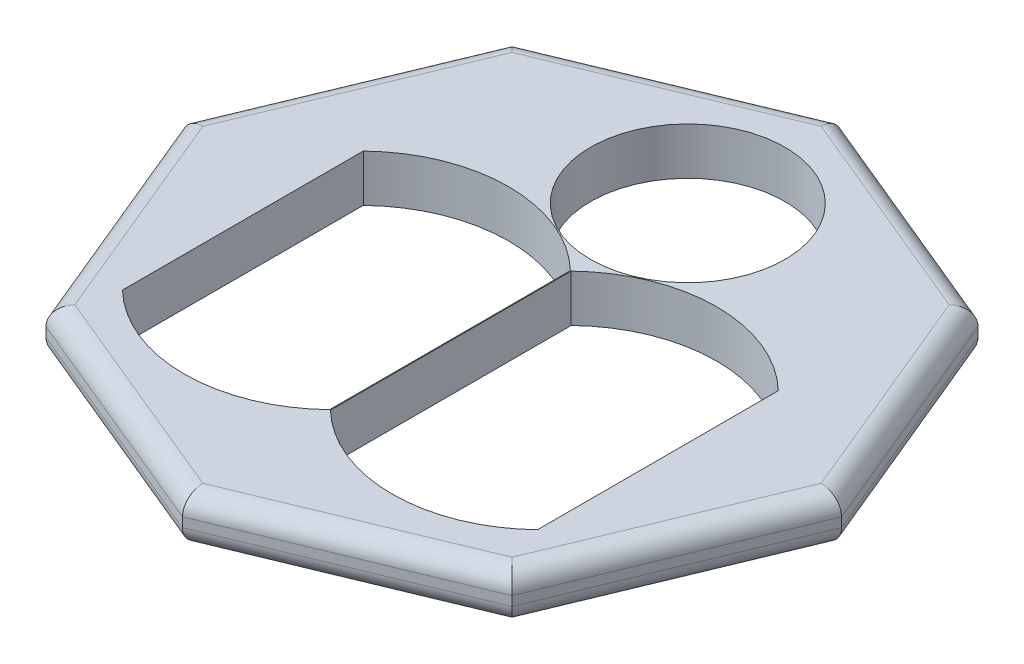
ISO-10303-21;
HEADER;
FILE_DESCRIPTION(('STEP AP214'),'2;1');
FILE_NAME('part.step','',(''),(''),'','','');
FILE_SCHEMA(('AUTOMOTIVE_DESIGN { 1 0 10303 214 1 1 1 1 }'));
ENDSEC;
DATA;
#1=APPLICATION_CONTEXT('core data for automotive mechanical design processes');
#2=APPLICATION_PROTOCOL_DEFINITION('international standard','automotive_design',2000,#1);
#3=PRODUCT_CONTEXT('',#1,'mechanical');
#4=PRODUCT('Part','Part','',(#3));
#5=PRODUCT_RELATED_PRODUCT_CATEGORY('part','',(#4));
#6=PRODUCT_DEFINITION_FORMATION('','',#4);
#7=PRODUCT_DEFINITION_CONTEXT('part definition',#1,'design');
#8=PRODUCT_DEFINITION('design','',#6,#7);
#9=PRODUCT_DEFINITION_SHAPE('','',#8);
#10=(LENGTH_UNIT() NAMED_UNIT(*) SI_UNIT(.MILLI.,.METRE.));
#11=(NAMED_UNIT(*) PLANE_ANGLE_UNIT() SI_UNIT($,.RADIAN.));
#12=(NAMED_UNIT(*) SI_UNIT($,.STERADIAN.) SOLID_ANGLE_UNIT());
#13=UNCERTAINTY_MEASURE_WITH_UNIT(LENGTH_MEASURE(1.E-05),#10,'distance_accuracy_value','');
#14=(GEOMETRIC_REPRESENTATION_CONTEXT(3) GLOBAL_UNCERTAINTY_ASSIGNED_CONTEXT((#13)) GLOBAL_UNIT_ASSIGNED_CONTEXT((#10,
#11,#12)) REPRESENTATION_CONTEXT('',''));
#15=CARTESIAN_POINT('',(0.,0.,0.));
#16=DIRECTION('',(0.,0.,1.));
#17=DIRECTION('',(1.,0.,0.));
#18=AXIS2_PLACEMENT_3D('',#15,#16,#17);
#19=CARTESIAN_POINT('',(0.,5.,0.));
#20=DIRECTION('',(0.,1.,0.));
#21=DIRECTION('',(0.,0.,1.));
#22=AXIS2_PLACEMENT_3D('',#19,#20,#21);
#23=PLANE('',#22);
#24=DIRECTION('',(0.382683432365079,0.,0.923879532511291));
#25=VECTOR('',#24,1.);
#26=CARTESIAN_POINT('',(22.9009782765069,5.,-23.9833704767987));
#27=LINE('',#26,#25);
#28=CARTESIAN_POINT('',(32.8352155994152,5.,3.75652620504112E-13));
#29=VERTEX_POINT('',#28);
#30=CARTESIAN_POINT('',(23.2180036120691,5.,-23.2180036120685));
#31=VERTEX_POINT('',#30);
#32=EDGE_CURVE('E327',#29,#31,#27,.F.);
#33=ORIENTED_EDGE('',*,*,#32,.T.);
#34=DIRECTION('',(0.923879532511283,0.,0.3826834323651));
#35=VECTOR('',#34,1.);
#36=CARTESIAN_POINT('',(-0.765366864729747,5.,-33.1522409349774));
#37=LINE('',#36,#35);
#38=CARTESIAN_POINT('',(0.,5.,-32.8352155994154));
#39=VERTEX_POINT('',#38);
#40=EDGE_CURVE('E329',#31,#39,#37,.F.);
#41=ORIENTED_EDGE('',*,*,#40,.T.);
#42=DIRECTION('',(-0.923879532511283,0.,0.3826834323651));
#43=VECTOR('',#42,1.);
#44=CARTESIAN_POINT('',(-23.9833704767993,5.,-22.9009782765063));
#45=LINE('',#44,#43);
#46=CARTESIAN_POINT('',(-23.2180036120691,5.,-23.2180036120685));
#47=VERTEX_POINT('',#46);
#48=EDGE_CURVE('E315',#39,#47,#45,.T.);
#49=ORIENTED_EDGE('',*,*,#48,.T.);
#50=DIRECTION('',(-0.382683432365079,0.,0.923879532511291));
#51=VECTOR('',#50,1.);
#52=CARTESIAN_POINT('',(-33.1522409349774,5.,0.765366864730565));
#53=LINE('',#52,#51);
#54=CARTESIAN_POINT('',(-32.8352155994152,5.,3.75475980022935E-13));
#55=VERTEX_POINT('',#54);
#56=EDGE_CURVE('E317',#47,#55,#53,.T.);
#57=ORIENTED_EDGE('',*,*,#56,.T.);
#58=DIRECTION('',(0.382683432365101,0.,0.923879532511283));
#59=VECTOR('',#58,1.);
#60=CARTESIAN_POINT('',(-22.9009782765063,5.,23.9833704767993));
#61=LINE('',#60,#59);
#62=CARTESIAN_POINT('',(-23.2180036120685,5.,23.2180036120691));
#63=VERTEX_POINT('',#62);
#64=EDGE_CURVE('E319',#55,#63,#61,.T.);
#65=ORIENTED_EDGE('',*,*,#64,.T.);
#66=DIRECTION('',(0.923879532511291,0.,0.382683432365079));
#67=VECTOR('',#66,1.);
#68=CARTESIAN_POINT('',(0.765366864729876,5.,33.1522409349771));
#69=LINE('',#68,#67);
#70=CARTESIAN_POINT('',(0.,5.,32.8352155994151));
#71=VERTEX_POINT('',#70);
#72=EDGE_CURVE('E321',#63,#71,#69,.T.);
#73=ORIENTED_EDGE('',*,*,#72,.T.);
#74=DIRECTION('',(-0.923879532511291,0.,0.382683432365079));
#75=VECTOR('',#74,1.);
#76=CARTESIAN_POINT('',(23.9833704767987,5.,22.9009782765069));
#77=LINE('',#76,#75);
#78=CARTESIAN_POINT('',(23.2180036120685,5.,23.2180036120691));
#79=VERTEX_POINT('',#78);
#80=EDGE_CURVE('E323',#71,#79,#77,.F.);
#81=ORIENTED_EDGE('',*,*,#80,.T.);
#82=DIRECTION('',(-0.382683432365101,0.,0.923879532511283));
#83=VECTOR('',#82,1.);
#84=CARTESIAN_POINT('',(33.1522409349774,5.,-0.765366864729796));
#85=LINE('',#84,#83);
#86=EDGE_CURVE('E325',#79,#29,#85,.F.);
#87=ORIENTED_EDGE('',*,*,#86,.T.);
#88=EDGE_LOOP('',(#33,#41,#49,#57,#65,#73,#81,#87));
#89=FACE_BOUND('',#88,.T.);
#90=CARTESIAN_POINT('',(0.,5.,-18.6706040221078));
#91=DIRECTION('',(0.,1.,0.));
#92=DIRECTION('',(0.,0.,1.));
#93=AXIS2_PLACEMENT_3D('',#90,#91,#92);
#94=CIRCLE('',#93,10.33);
#95=CARTESIAN_POINT('',(0.,5.,-8.34060402210783));
#96=VERTEX_POINT('',#95);
#97=EDGE_CURVE('E378',#96,#96,#94,.T.);
#98=ORIENTED_EDGE('',*,*,#97,.F.);
#99=EDGE_LOOP('',(#98));
#100=FACE_BOUND('',#99,.T.);
#101=CARTESIAN_POINT('',(-11.0441647433153,5.,7.95397287287877));
#102=DIRECTION('',(0.,1.,0.));
#103=DIRECTION('',(0.,0.,1.));
#104=AXIS2_PLACEMENT_3D('',#101,#102,#103);
#105=CIRCLE('',#104,15.8242072951014);
#106=CARTESIAN_POINT('',(-22.0441647433153,5.,19.3296283053512));
#107=VERTEX_POINT('',#106);
#108=CARTESIAN_POINT('',(-0.0441647433152698,5.,19.3296283053512));
#109=VERTEX_POINT('',#108);
#110=EDGE_CURVE('E247',#107,#109,#105,.T.);
#111=ORIENTED_EDGE('',*,*,#110,.F.);
#112=DIRECTION('',(0.,0.,1.));
#113=VECTOR('',#112,1.);
#114=CARTESIAN_POINT('',(-22.0441647433153,5.,-6.24615291811811));
#115=LINE('',#114,#113);
#116=CARTESIAN_POINT('',(-22.0441647433153,5.,-6.24615291811811));
#117=VERTEX_POINT('',#116);
#118=EDGE_CURVE('E262',#117,#107,#115,.T.);
#119=ORIENTED_EDGE('',*,*,#118,.F.);
#120=CARTESIAN_POINT('',(-11.0441647433153,5.,5.1295025143543));
#121=DIRECTION('',(0.,1.,0.));
#122=DIRECTION('',(0.,0.,1.));
#123=AXIS2_PLACEMENT_3D('',#120,#121,#122);
#124=CIRCLE('',#123,15.8242072951014);
#125=CARTESIAN_POINT('',(-0.0441647433152732,5.,-6.24615291811811));
#126=VERTEX_POINT('',#125);
#127=EDGE_CURVE('E251',#117,#126,#124,.F.);
#128=ORIENTED_EDGE('',*,*,#127,.T.);
#129=DIRECTION('',(0.,0.,1.));
#130=VECTOR('',#129,1.);
#131=CARTESIAN_POINT('',(-0.0441647433152732,5.,-6.24615291811811));
#132=LINE('',#131,#130);
#133=EDGE_CURVE('E255',#126,#109,#132,.T.);
#134=ORIENTED_EDGE('',*,*,#133,.T.);
#135=EDGE_LOOP('',(#111,#119,#128,#134));
#136=FACE_BOUND('',#135,.T.);
#137=CARTESIAN_POINT('',(11.0441647433153,5.,7.95397287287877));
#138=DIRECTION('',(0.,-1.,0.));
#139=DIRECTION('',(0.,0.,1.));
#140=AXIS2_PLACEMENT_3D('',#137,#138,#139);
#141=CIRCLE('',#140,15.8242072951014);
#142=CARTESIAN_POINT('',(22.0441647433153,5.,19.3296283053512));
#143=VERTEX_POINT('',#142);
#144=CARTESIAN_POINT('',(0.0441647433152698,5.,19.3296283053512));
#145=VERTEX_POINT('',#144);
#146=EDGE_CURVE('E211',#143,#145,#141,.T.);
#147=ORIENTED_EDGE('',*,*,#146,.T.);
#148=DIRECTION('',(0.,0.,1.));
#149=VECTOR('',#148,1.);
#150=CARTESIAN_POINT('',(0.0441647433152732,5.,-6.24615291811811));
#151=LINE('',#150,#149);
#152=CARTESIAN_POINT('',(0.0441647433152732,5.,-6.24615291811811));
#153=VERTEX_POINT('',#152);
#154=EDGE_CURVE('E227',#153,#145,#151,.T.);
#155=ORIENTED_EDGE('',*,*,#154,.F.);
#156=CARTESIAN_POINT('',(11.0441647433153,5.,5.1295025143543));
#157=DIRECTION('',(0.,-1.,0.));
#158=DIRECTION('',(0.,0.,1.));
#159=AXIS2_PLACEMENT_3D('',#156,#157,#158);
#160=CIRCLE('',#159,15.8242072951014);
#161=CARTESIAN_POINT('',(22.0441647433153,5.,-6.24615291811811));
#162=VERTEX_POINT('',#161);
#163=EDGE_CURVE('E213',#162,#153,#160,.F.);
#164=ORIENTED_EDGE('',*,*,#163,.F.);
#165=DIRECTION('',(0.,0.,1.));
#166=VECTOR('',#165,1.);
#167=CARTESIAN_POINT('',(22.0441647433153,5.,-6.24615291811811));
#168=LINE('',#167,#166);
#169=EDGE_CURVE('E199',#162,#143,#168,.T.);
#170=ORIENTED_EDGE('',*,*,#169,.T.);
#171=EDGE_LOOP('',(#147,#155,#164,#170));
#172=FACE_BOUND('',#171,.T.);
#173=ADVANCED_FACE('F33',(#89,#100,#136,#172),#23,.T.);
#174=CARTESIAN_POINT('',(0.,0.,0.));
#175=DIRECTION('',(0.,1.,0.));
#176=DIRECTION('',(0.,0.,1.));
#177=AXIS2_PLACEMENT_3D('',#174,#175,#176);
#178=PLANE('',#177);
#179=DIRECTION('',(-0.923879532511283,0.,0.3826834323651));
#180=VECTOR('',#179,1.);
#181=CARTESIAN_POINT('',(-11.6090018060347,0.,-28.0266096057419));
#182=LINE('',#181,#180);
#183=CARTESIAN_POINT('',(-23.2180036120691,0.,-23.2180036120685));
#184=VERTEX_POINT('',#183);
#185=CARTESIAN_POINT('',(0.,0.,-32.8352155994154));
#186=VERTEX_POINT('',#185);
#187=EDGE_CURVE('E292',#184,#186,#182,.F.);
#188=ORIENTED_EDGE('',*,*,#187,.T.);
#189=DIRECTION('',(0.923879532511283,0.,0.3826834323651));
#190=VECTOR('',#189,1.);
#191=CARTESIAN_POINT('',(11.6090018060347,0.,-28.0266096057419));
#192=LINE('',#191,#190);
#193=CARTESIAN_POINT('',(23.2180036120691,0.,-23.2180036120685));
#194=VERTEX_POINT('',#193);
#195=EDGE_CURVE('E306',#186,#194,#192,.T.);
#196=ORIENTED_EDGE('',*,*,#195,.T.);
#197=DIRECTION('',(0.382683432365079,0.,0.923879532511291));
#198=VECTOR('',#197,1.);
#199=CARTESIAN_POINT('',(28.0266096057422,0.,-11.6090018060341));
#200=LINE('',#199,#198);
#201=CARTESIAN_POINT('',(32.8352155994152,0.,3.75475980022935E-13));
#202=VERTEX_POINT('',#201);
#203=EDGE_CURVE('E304',#194,#202,#200,.T.);
#204=ORIENTED_EDGE('',*,*,#203,.T.);
#205=DIRECTION('',(-0.382683432365101,0.,0.923879532511283));
#206=VECTOR('',#205,1.);
#207=CARTESIAN_POINT('',(28.0266096057419,0.,11.6090018060347));
#208=LINE('',#207,#206);
#209=CARTESIAN_POINT('',(23.2180036120685,0.,23.2180036120691));
#210=VERTEX_POINT('',#209);
#211=EDGE_CURVE('E302',#202,#210,#208,.T.);
#212=ORIENTED_EDGE('',*,*,#211,.T.);
#213=DIRECTION('',(-0.923879532511291,0.,0.382683432365079));
#214=VECTOR('',#213,1.);
#215=CARTESIAN_POINT('',(11.6090018060341,0.,28.0266096057422));
#216=LINE('',#215,#214);
#217=CARTESIAN_POINT('',(0.,0.,32.8352155994151));
#218=VERTEX_POINT('',#217);
#219=EDGE_CURVE('E300',#210,#218,#216,.T.);
#220=ORIENTED_EDGE('',*,*,#219,.T.);
#221=DIRECTION('',(0.923879532511291,0.,0.382683432365079));
#222=VECTOR('',#221,1.);
#223=CARTESIAN_POINT('',(-11.6090018060341,0.,28.0266096057422));
#224=LINE('',#223,#222);
#225=CARTESIAN_POINT('',(-23.2180036120685,0.,23.2180036120691));
#226=VERTEX_POINT('',#225);
#227=EDGE_CURVE('E298',#218,#226,#224,.F.);
#228=ORIENTED_EDGE('',*,*,#227,.T.);
#229=DIRECTION('',(0.382683432365101,0.,0.923879532511283));
#230=VECTOR('',#229,1.);
#231=CARTESIAN_POINT('',(-28.0266096057419,0.,11.6090018060347));
#232=LINE('',#231,#230);
#233=CARTESIAN_POINT('',(-32.8352155994152,0.,3.75652620504112E-13));
#234=VERTEX_POINT('',#233);
#235=EDGE_CURVE('E296',#226,#234,#232,.F.);
#236=ORIENTED_EDGE('',*,*,#235,.T.);
#237=DIRECTION('',(-0.382683432365079,0.,0.923879532511291));
#238=VECTOR('',#237,1.);
#239=CARTESIAN_POINT('',(-28.0266096057422,0.,-11.6090018060341));
#240=LINE('',#239,#238);
#241=EDGE_CURVE('E294',#234,#184,#240,.F.);
#242=ORIENTED_EDGE('',*,*,#241,.T.);
#243=EDGE_LOOP('',(#188,#196,#204,#212,#220,#228,#236,#242));
#244=FACE_BOUND('',#243,.T.);
#245=CARTESIAN_POINT('',(0.,0.,-18.6706040221078));
#246=DIRECTION('',(0.,1.,0.));
#247=DIRECTION('',(0.,0.,1.));
#248=AXIS2_PLACEMENT_3D('',#245,#246,#247);
#249=CIRCLE('',#248,10.33);
#250=CARTESIAN_POINT('',(0.,0.,-8.34060402210783));
#251=VERTEX_POINT('',#250);
#252=EDGE_CURVE('E214',#251,#251,#249,.T.);
#253=ORIENTED_EDGE('',*,*,#252,.T.);
#254=EDGE_LOOP('',(#253));
#255=FACE_BOUND('',#254,.T.);
#256=DIRECTION('',(0.,0.,1.));
#257=VECTOR('',#256,1.);
#258=CARTESIAN_POINT('',(-22.0441647433153,0.,-6.24615291811811));
#259=LINE('',#258,#257);
#260=CARTESIAN_POINT('',(-22.0441647433153,0.,-6.24615291811811));
#261=VERTEX_POINT('',#260);
#262=CARTESIAN_POINT('',(-22.0441647433153,0.,19.3296283053512));
#263=VERTEX_POINT('',#262);
#264=EDGE_CURVE('E261',#261,#263,#259,.T.);
#265=ORIENTED_EDGE('',*,*,#264,.T.);
#266=CARTESIAN_POINT('',(-11.0441647433153,0.,7.95397287287877));
#267=DIRECTION('',(0.,1.,0.));
#268=DIRECTION('',(0.,0.,1.));
#269=AXIS2_PLACEMENT_3D('',#266,#267,#268);
#270=CIRCLE('',#269,15.8242072951014);
#271=CARTESIAN_POINT('',(-0.0441647433152698,0.,19.3296283053512));
#272=VERTEX_POINT('',#271);
#273=EDGE_CURVE('E248',#263,#272,#270,.T.);
#274=ORIENTED_EDGE('',*,*,#273,.T.);
#275=DIRECTION('',(0.,0.,1.));
#276=VECTOR('',#275,1.);
#277=CARTESIAN_POINT('',(-0.0441647433152732,0.,-6.24615291811811));
#278=LINE('',#277,#276);
#279=CARTESIAN_POINT('',(-0.0441647433152732,0.,-6.24615291811811));
#280=VERTEX_POINT('',#279);
#281=EDGE_CURVE('E258',#280,#272,#278,.T.);
#282=ORIENTED_EDGE('',*,*,#281,.F.);
#283=CARTESIAN_POINT('',(-11.0441647433153,0.,5.1295025143543));
#284=DIRECTION('',(0.,1.,0.));
#285=DIRECTION('',(0.,0.,1.));
#286=AXIS2_PLACEMENT_3D('',#283,#284,#285);
#287=CIRCLE('',#286,15.8242072951014);
#288=EDGE_CURVE('E253',#261,#280,#287,.F.);
#289=ORIENTED_EDGE('',*,*,#288,.F.);
#290=EDGE_LOOP('',(#265,#274,#282,#289));
#291=FACE_BOUND('',#290,.T.);
#292=DIRECTION('',(0.,0.,1.));
#293=VECTOR('',#292,1.);
#294=CARTESIAN_POINT('',(22.0441647433153,0.,-6.24615291811811));
#295=LINE('',#294,#293);
#296=CARTESIAN_POINT('',(22.0441647433153,0.,-6.24615291811811));
#297=VERTEX_POINT('',#296);
#298=CARTESIAN_POINT('',(22.0441647433153,0.,19.3296283053512));
#299=VERTEX_POINT('',#298);
#300=EDGE_CURVE('E202',#297,#299,#295,.T.);
#301=ORIENTED_EDGE('',*,*,#300,.F.);
#302=CARTESIAN_POINT('',(11.0441647433153,0.,5.1295025143543));
#303=DIRECTION('',(0.,-1.,0.));
#304=DIRECTION('',(0.,0.,1.));
#305=AXIS2_PLACEMENT_3D('',#302,#303,#304);
#306=CIRCLE('',#305,15.8242072951014);
#307=CARTESIAN_POINT('',(0.0441647433152732,0.,-6.24615291811811));
#308=VERTEX_POINT('',#307);
#309=EDGE_CURVE('E235',#297,#308,#306,.F.);
#310=ORIENTED_EDGE('',*,*,#309,.T.);
#311=DIRECTION('',(0.,0.,1.));
#312=VECTOR('',#311,1.);
#313=CARTESIAN_POINT('',(0.0441647433152732,0.,-6.24615291811811));
#314=LINE('',#313,#312);
#315=CARTESIAN_POINT('',(0.0441647433152698,0.,19.3296283053512));
#316=VERTEX_POINT('',#315);
#317=EDGE_CURVE('E231',#308,#316,#314,.T.);
#318=ORIENTED_EDGE('',*,*,#317,.T.);
#319=CARTESIAN_POINT('',(11.0441647433153,0.,7.95397287287877));
#320=DIRECTION('',(0.,-1.,0.));
#321=DIRECTION('',(0.,0.,1.));
#322=AXIS2_PLACEMENT_3D('',#319,#320,#321);
#323=CIRCLE('',#322,15.8242072951014);
#324=EDGE_CURVE('E221',#299,#316,#323,.T.);
#325=ORIENTED_EDGE('',*,*,#324,.F.);
#326=EDGE_LOOP('',(#301,#310,#318,#325));
#327=FACE_BOUND('',#326,.T.);
#328=ADVANCED_FACE('F441',(#244,#255,#291,#327),#178,.F.);
#329=CARTESIAN_POINT('',(-4.06544380709532E-13,5.,-35.));
#330=DIRECTION('',(0.3826834323651,0.,0.923879532511282));
#331=DIRECTION('',(0.923879532511283,0.,-0.3826834323651));
#332=AXIS2_PLACEMENT_3D('',#329,#330,#331);
#333=PLANE('',#332);
#334=DIRECTION('',(0.,-1.,0.));
#335=VECTOR('',#334,1.);
#336=CARTESIAN_POINT('',(-4.06544380709532E-13,5.,-35.));
#337=LINE('',#336,#335);
#338=CARTESIAN_POINT('',(-4.06544380709532E-13,3.,-35.));
#339=VERTEX_POINT('',#338);
#340=CARTESIAN_POINT('',(-4.06544380709532E-13,2.,-35.));
#341=VERTEX_POINT('',#340);
#342=EDGE_CURVE('E290',#339,#341,#337,.T.);
#343=ORIENTED_EDGE('',*,*,#342,.T.);
#344=DIRECTION('',(-0.923879532511283,0.,0.3826834323651));
#345=VECTOR('',#344,1.);
#346=CARTESIAN_POINT('',(-4.06544380709532E-13,2.,-35.));
#347=LINE('',#346,#345);
#348=CARTESIAN_POINT('',(-24.7487373415295,2.,-24.7487373415289));
#349=VERTEX_POINT('',#348);
#350=EDGE_CURVE('E11',#341,#349,#347,.T.);
#351=ORIENTED_EDGE('',*,*,#350,.T.);
#352=DIRECTION('',(0.,-1.,0.));
#353=VECTOR('',#352,1.);
#354=CARTESIAN_POINT('',(-24.7487373415295,5.,-24.7487373415289));
#355=LINE('',#354,#353);
#356=CARTESIAN_POINT('',(-24.7487373415295,3.,-24.7487373415289));
#357=VERTEX_POINT('',#356);
#358=EDGE_CURVE('E288',#357,#349,#355,.T.);
#359=ORIENTED_EDGE('',*,*,#358,.F.);
#360=DIRECTION('',(-0.923879532511283,0.,0.3826834323651));
#361=VECTOR('',#360,1.);
#362=CARTESIAN_POINT('',(3.25108718089903E-13,3.,-35.0000000000003));
#363=LINE('',#362,#361);
#364=EDGE_CURVE('E42',#357,#339,#363,.F.);
#365=ORIENTED_EDGE('',*,*,#364,.T.);
#366=EDGE_LOOP('',(#343,#351,#359,#365));
#367=FACE_BOUND('',#366,.T.);
#368=ADVANCED_FACE('F424',(#367),#333,.F.);
#369=CARTESIAN_POINT('',(-24.7487373415295,5.,-24.7487373415289));
#370=DIRECTION('',(0.923879532511291,0.,0.382683432365079));
#371=DIRECTION('',(0.382683432365079,0.,-0.923879532511291));
#372=AXIS2_PLACEMENT_3D('',#369,#370,#371);
#373=PLANE('',#372);
#374=DIRECTION('',(0.,-1.,0.));
#375=VECTOR('',#374,1.);
#376=CARTESIAN_POINT('',(-35.,5.,4.06574307873272E-13));
#377=LINE('',#376,#375);
#378=CARTESIAN_POINT('',(-35.,3.,4.06574307873272E-13));
#379=VERTEX_POINT('',#378);
#380=CARTESIAN_POINT('',(-35.,2.,4.06574307873272E-13));
#381=VERTEX_POINT('',#380);
#382=EDGE_CURVE('E285',#379,#381,#377,.T.);
#383=ORIENTED_EDGE('',*,*,#382,.F.);
#384=DIRECTION('',(-0.382683432365079,0.,0.923879532511291));
#385=VECTOR('',#384,1.);
#386=CARTESIAN_POINT('',(-24.7487373415295,3.,-24.7487373415289));
#387=LINE('',#386,#385);
#388=EDGE_CURVE('E55',#379,#357,#387,.F.);
#389=ORIENTED_EDGE('',*,*,#388,.T.);
#390=ORIENTED_EDGE('',*,*,#358,.T.);
#391=DIRECTION('',(-0.382683432365079,0.,0.923879532511291));
#392=VECTOR('',#391,1.);
#393=CARTESIAN_POINT('',(-24.7487373415295,2.,-24.7487373415289));
#394=LINE('',#393,#392);
#395=EDGE_CURVE('E352',#349,#381,#394,.T.);
#396=ORIENTED_EDGE('',*,*,#395,.T.);
#397=EDGE_LOOP('',(#383,#389,#390,#396));
#398=FACE_BOUND('',#397,.T.);
#399=ADVANCED_FACE('F452',(#398),#373,.F.);
#400=CARTESIAN_POINT('',(-35.,5.,4.06574307873272E-13));
#401=DIRECTION('',(0.923879532511282,0.,-0.3826834323651));
#402=DIRECTION('',(-0.382683432365101,0.,-0.923879532511283));
#403=AXIS2_PLACEMENT_3D('',#400,#401,#402);
#404=PLANE('',#403);
#405=ORIENTED_EDGE('',*,*,#382,.T.);
#406=DIRECTION('',(0.382683432365101,0.,0.923879532511283));
#407=VECTOR('',#406,1.);
#408=CARTESIAN_POINT('',(-35.,2.,4.06574307873272E-13));
#409=LINE('',#408,#407);
#410=CARTESIAN_POINT('',(-24.7487373415289,2.,24.7487373415295));
#411=VERTEX_POINT('',#410);
#412=EDGE_CURVE('E350',#381,#411,#409,.T.);
#413=ORIENTED_EDGE('',*,*,#412,.T.);
#414=DIRECTION('',(0.,-1.,0.));
#415=VECTOR('',#414,1.);
#416=CARTESIAN_POINT('',(-24.7487373415289,5.,24.7487373415295));
#417=LINE('',#416,#415);
#418=CARTESIAN_POINT('',(-24.7487373415289,3.,24.7487373415295));
#419=VERTEX_POINT('',#418);
#420=EDGE_CURVE('E282',#419,#411,#417,.T.);
#421=ORIENTED_EDGE('',*,*,#420,.F.);
#422=DIRECTION('',(0.382683432365101,0.,0.923879532511283));
#423=VECTOR('',#422,1.);
#424=CARTESIAN_POINT('',(-35.,3.,4.01023047372544E-13));
#425=LINE('',#424,#423);
#426=EDGE_CURVE('E348',#419,#379,#425,.F.);
#427=ORIENTED_EDGE('',*,*,#426,.T.);
#428=EDGE_LOOP('',(#405,#413,#421,#427));
#429=FACE_BOUND('',#428,.T.);
#430=ADVANCED_FACE('F455',(#429),#404,.F.);
#431=CARTESIAN_POINT('',(-24.7487373415289,5.,24.7487373415295));
#432=DIRECTION('',(0.382683432365079,0.,-0.923879532511291));
#433=DIRECTION('',(-0.923879532511291,0.,-0.382683432365079));
#434=AXIS2_PLACEMENT_3D('',#431,#432,#433);
#435=PLANE('',#434);
#436=ORIENTED_EDGE('',*,*,#420,.T.);
#437=DIRECTION('',(0.923879532511291,0.,0.382683432365079));
#438=VECTOR('',#437,1.);
#439=CARTESIAN_POINT('',(-24.7487373415289,2.,24.7487373415295));
#440=LINE('',#439,#438);
#441=CARTESIAN_POINT('',(4.00730791215742E-13,2.,35.));
#442=VERTEX_POINT('',#441);
#443=EDGE_CURVE('E346',#411,#442,#440,.T.);
#444=ORIENTED_EDGE('',*,*,#443,.T.);
#445=DIRECTION('',(0.,-1.,0.));
#446=VECTOR('',#445,1.);
#447=CARTESIAN_POINT('',(4.00730791215742E-13,5.,35.));
#448=LINE('',#447,#446);
#449=CARTESIAN_POINT('',(4.00730791215742E-13,3.,35.));
#450=VERTEX_POINT('',#449);
#451=EDGE_CURVE('E279',#450,#442,#448,.T.);
#452=ORIENTED_EDGE('',*,*,#451,.F.);
#453=DIRECTION('',(0.923879532511291,0.,0.382683432365079));
#454=VECTOR('',#453,1.);
#455=CARTESIAN_POINT('',(-24.7487373415289,3.,24.7487373415295));
#456=LINE('',#455,#454);
#457=EDGE_CURVE('E344',#450,#419,#456,.F.);
#458=ORIENTED_EDGE('',*,*,#457,.T.);
#459=EDGE_LOOP('',(#436,#444,#452,#458));
#460=FACE_BOUND('',#459,.T.);
#461=ADVANCED_FACE('F469',(#460),#435,.F.);
#462=CARTESIAN_POINT('',(-0.0441647433152732,0.,-6.24615291811811));
#463=DIRECTION('',(-1.,0.,0.));
#464=DIRECTION('',(0.,0.,1.));
#465=AXIS2_PLACEMENT_3D('',#462,#463,#464);
#466=PLANE('',#465);
#467=ORIENTED_EDGE('',*,*,#133,.F.);
#468=DIRECTION('',(0.,1.,0.));
#469=VECTOR('',#468,1.);
#470=CARTESIAN_POINT('',(-0.0441647433152732,0.,-6.24615291811811));
#471=LINE('',#470,#469);
#472=EDGE_CURVE('E277',#280,#126,#471,.T.);
#473=ORIENTED_EDGE('',*,*,#472,.F.);
#474=ORIENTED_EDGE('',*,*,#281,.T.);
#475=DIRECTION('',(0.,1.,0.));
#476=VECTOR('',#475,1.);
#477=CARTESIAN_POINT('',(-0.0441647433152698,0.,19.3296283053512));
#478=LINE('',#477,#476);
#479=EDGE_CURVE('E274',#272,#109,#478,.T.);
#480=ORIENTED_EDGE('',*,*,#479,.T.);
#481=EDGE_LOOP('',(#467,#473,#474,#480));
#482=FACE_BOUND('',#481,.T.);
#483=ADVANCED_FACE('F514',(#482),#466,.T.);
#484=CARTESIAN_POINT('',(-22.0441647433153,0.,-6.24615291811811));
#485=DIRECTION('',(-1.,0.,0.));
#486=DIRECTION('',(0.,0.,1.));
#487=AXIS2_PLACEMENT_3D('',#484,#485,#486);
#488=PLANE('',#487);
#489=ORIENTED_EDGE('',*,*,#118,.T.);
#490=DIRECTION('',(0.,1.,0.));
#491=VECTOR('',#490,1.);
#492=CARTESIAN_POINT('',(-22.0441647433153,0.,19.3296283053512));
#493=LINE('',#492,#491);
#494=EDGE_CURVE('E272',#263,#107,#493,.T.);
#495=ORIENTED_EDGE('',*,*,#494,.F.);
#496=ORIENTED_EDGE('',*,*,#264,.F.);
#497=DIRECTION('',(0.,1.,0.));
#498=VECTOR('',#497,1.);
#499=CARTESIAN_POINT('',(-22.0441647433153,0.,-6.24615291811811));
#500=LINE('',#499,#498);
#501=EDGE_CURVE('E265',#261,#117,#500,.T.);
#502=ORIENTED_EDGE('',*,*,#501,.T.);
#503=EDGE_LOOP('',(#489,#495,#496,#502));
#504=FACE_BOUND('',#503,.T.);
#505=ADVANCED_FACE('F726',(#504),#488,.F.);
#506=CARTESIAN_POINT('',(-11.0441647433153,0.,5.1295025143543));
#507=DIRECTION('',(0.,1.,0.));
#508=DIRECTION('',(0.,0.,1.));
#509=AXIS2_PLACEMENT_3D('',#506,#507,#508);
#510=CYLINDRICAL_SURFACE('',#509,15.8242072951014);
#511=ORIENTED_EDGE('',*,*,#127,.F.);
#512=ORIENTED_EDGE('',*,*,#501,.F.);
#513=ORIENTED_EDGE('',*,*,#288,.T.);
#514=ORIENTED_EDGE('',*,*,#472,.T.);
#515=EDGE_LOOP('',(#511,#512,#513,#514));
#516=FACE_BOUND('',#515,.T.);
#517=ADVANCED_FACE('F717',(#516),#510,.F.);
#518=CARTESIAN_POINT('',(-11.0441647433153,0.,7.95397287287877));
#519=DIRECTION('',(0.,1.,0.));
#520=DIRECTION('',(0.,0.,1.));
#521=AXIS2_PLACEMENT_3D('',#518,#519,#520);
#522=CYLINDRICAL_SURFACE('',#521,15.8242072951014);
#523=ORIENTED_EDGE('',*,*,#110,.T.);
#524=ORIENTED_EDGE('',*,*,#479,.F.);
#525=ORIENTED_EDGE('',*,*,#273,.F.);
#526=ORIENTED_EDGE('',*,*,#494,.T.);
#527=EDGE_LOOP('',(#523,#524,#525,#526));
#528=FACE_BOUND('',#527,.T.);
#529=ADVANCED_FACE('F709',(#528),#522,.F.);
#530=CARTESIAN_POINT('',(4.06544380709532E-13,5.,-35.));
#531=DIRECTION('',(-0.3826834323651,0.,0.923879532511282));
#532=DIRECTION('',(-0.923879532511283,0.,-0.3826834323651));
#533=AXIS2_PLACEMENT_3D('',#530,#531,#532);
#534=PLANE('',#533);
#535=DIRECTION('',(0.,-1.,0.));
#536=VECTOR('',#535,1.);
#537=CARTESIAN_POINT('',(24.7487373415295,5.,-24.7487373415289));
#538=LINE('',#537,#536);
#539=CARTESIAN_POINT('',(24.7487373415295,3.,-24.7487373415289));
#540=VERTEX_POINT('',#539);
#541=CARTESIAN_POINT('',(24.7487373415295,2.,-24.7487373415289));
#542=VERTEX_POINT('',#541);
#543=EDGE_CURVE('E244',#540,#542,#538,.T.);
#544=ORIENTED_EDGE('',*,*,#543,.T.);
#545=DIRECTION('',(0.923879532511283,0.,0.3826834323651));
#546=VECTOR('',#545,1.);
#547=CARTESIAN_POINT('',(4.06544380709532E-13,2.,-35.));
#548=LINE('',#547,#546);
#549=EDGE_CURVE('E312',#542,#341,#548,.F.);
#550=ORIENTED_EDGE('',*,*,#549,.T.);
#551=ORIENTED_EDGE('',*,*,#342,.F.);
#552=DIRECTION('',(0.923879532511283,0.,0.3826834323651));
#553=VECTOR('',#552,1.);
#554=CARTESIAN_POINT('',(24.7487373415295,3.,-24.7487373415289));
#555=LINE('',#554,#553);
#556=EDGE_CURVE('E309',#339,#540,#555,.T.);
#557=ORIENTED_EDGE('',*,*,#556,.T.);
#558=EDGE_LOOP('',(#544,#550,#551,#557));
#559=FACE_BOUND('',#558,.T.);
#560=ADVANCED_FACE('F426',(#559),#534,.F.);
#561=CARTESIAN_POINT('',(24.7487373415295,5.,-24.7487373415289));
#562=DIRECTION('',(-0.923879532511291,0.,0.382683432365079));
#563=DIRECTION('',(-0.382683432365079,0.,-0.923879532511291));
#564=AXIS2_PLACEMENT_3D('',#561,#562,#563);
#565=PLANE('',#564);
#566=DIRECTION('',(0.,-1.,0.));
#567=VECTOR('',#566,1.);
#568=CARTESIAN_POINT('',(35.,5.,4.06574307873272E-13));
#569=LINE('',#568,#567);
#570=CARTESIAN_POINT('',(35.,3.,4.06574307873272E-13));
#571=VERTEX_POINT('',#570);
#572=CARTESIAN_POINT('',(35.,2.,4.06574307873272E-13));
#573=VERTEX_POINT('',#572);
#574=EDGE_CURVE('E241',#571,#573,#569,.T.);
#575=ORIENTED_EDGE('',*,*,#574,.T.);
#576=DIRECTION('',(0.382683432365079,0.,0.923879532511291));
#577=VECTOR('',#576,1.);
#578=CARTESIAN_POINT('',(24.7487373415295,2.,-24.7487373415289));
#579=LINE('',#578,#577);
#580=EDGE_CURVE('E334',#573,#542,#579,.F.);
#581=ORIENTED_EDGE('',*,*,#580,.T.);
#582=ORIENTED_EDGE('',*,*,#543,.F.);
#583=DIRECTION('',(0.382683432365079,0.,0.923879532511291));
#584=VECTOR('',#583,1.);
#585=CARTESIAN_POINT('',(35.,3.,4.06467394464816E-13));
#586=LINE('',#585,#584);
#587=EDGE_CURVE('E332',#540,#571,#586,.T.);
#588=ORIENTED_EDGE('',*,*,#587,.T.);
#589=EDGE_LOOP('',(#575,#581,#582,#588));
#590=FACE_BOUND('',#589,.T.);
#591=ADVANCED_FACE('F489',(#590),#565,.F.);
#592=CARTESIAN_POINT('',(35.,5.,4.06574307873272E-13));
#593=DIRECTION('',(-0.923879532511282,0.,-0.3826834323651));
#594=DIRECTION('',(0.382683432365101,0.,-0.923879532511283));
#595=AXIS2_PLACEMENT_3D('',#592,#593,#594);
#596=PLANE('',#595);
#597=DIRECTION('',(0.,-1.,0.));
#598=VECTOR('',#597,1.);
#599=CARTESIAN_POINT('',(24.7487373415289,5.,24.7487373415295));
#600=LINE('',#599,#598);
#601=CARTESIAN_POINT('',(24.7487373415289,3.,24.7487373415295));
#602=VERTEX_POINT('',#601);
#603=CARTESIAN_POINT('',(24.7487373415289,2.,24.7487373415295));
#604=VERTEX_POINT('',#603);
#605=EDGE_CURVE('E238',#602,#604,#600,.T.);
#606=ORIENTED_EDGE('',*,*,#605,.T.);
#607=DIRECTION('',(-0.382683432365101,0.,0.923879532511283));
#608=VECTOR('',#607,1.);
#609=CARTESIAN_POINT('',(35.,2.,4.06574307873272E-13));
#610=LINE('',#609,#608);
#611=EDGE_CURVE('E338',#604,#573,#610,.F.);
#612=ORIENTED_EDGE('',*,*,#611,.T.);
#613=ORIENTED_EDGE('',*,*,#574,.F.);
#614=DIRECTION('',(-0.382683432365101,0.,0.923879532511283));
#615=VECTOR('',#614,1.);
#616=CARTESIAN_POINT('',(24.7487373415289,3.,24.7487373415295));
#617=LINE('',#616,#615);
#618=EDGE_CURVE('E336',#571,#602,#617,.T.);
#619=ORIENTED_EDGE('',*,*,#618,.T.);
#620=EDGE_LOOP('',(#606,#612,#613,#619));
#621=FACE_BOUND('',#620,.T.);
#622=ADVANCED_FACE('F491',(#621),#596,.F.);
#623=CARTESIAN_POINT('',(24.7487373415289,5.,24.7487373415295));
#624=DIRECTION('',(-0.382683432365079,0.,-0.923879532511291));
#625=DIRECTION('',(0.923879532511291,0.,-0.382683432365079));
#626=AXIS2_PLACEMENT_3D('',#623,#624,#625);
#627=PLANE('',#626);
#628=ORIENTED_EDGE('',*,*,#451,.T.);
#629=DIRECTION('',(-0.923879532511291,0.,0.382683432365079));
#630=VECTOR('',#629,1.);
#631=CARTESIAN_POINT('',(24.7487373415289,2.,24.7487373415295));
#632=LINE('',#631,#630);
#633=EDGE_CURVE('E342',#442,#604,#632,.F.);
#634=ORIENTED_EDGE('',*,*,#633,.T.);
#635=ORIENTED_EDGE('',*,*,#605,.F.);
#636=DIRECTION('',(-0.923879532511291,0.,0.382683432365079));
#637=VECTOR('',#636,1.);
#638=CARTESIAN_POINT('',(-4.0612880518257E-13,3.,35.));
#639=LINE('',#638,#637);
#640=EDGE_CURVE('E340',#602,#450,#639,.T.);
#641=ORIENTED_EDGE('',*,*,#640,.T.);
#642=EDGE_LOOP('',(#628,#634,#635,#641));
#643=FACE_BOUND('',#642,.T.);
#644=ADVANCED_FACE('F471',(#643),#627,.F.);
#645=CARTESIAN_POINT('',(11.0441647433153,0.,5.1295025143543));
#646=DIRECTION('',(0.,1.,0.));
#647=DIRECTION('',(0.,0.,1.));
#648=AXIS2_PLACEMENT_3D('',#645,#646,#647);
#649=CYLINDRICAL_SURFACE('',#648,15.8242072951014);
#650=ORIENTED_EDGE('',*,*,#163,.T.);
#651=DIRECTION('',(0.,1.,0.));
#652=VECTOR('',#651,1.);
#653=CARTESIAN_POINT('',(0.0441647433152732,0.,-6.24615291811811));
#654=LINE('',#653,#652);
#655=EDGE_CURVE('E229',#308,#153,#654,.T.);
#656=ORIENTED_EDGE('',*,*,#655,.F.);
#657=ORIENTED_EDGE('',*,*,#309,.F.);
#658=DIRECTION('',(0.,1.,0.));
#659=VECTOR('',#658,1.);
#660=CARTESIAN_POINT('',(22.0441647433153,0.,-6.24615291811811));
#661=LINE('',#660,#659);
#662=EDGE_CURVE('E219',#297,#162,#661,.T.);
#663=ORIENTED_EDGE('',*,*,#662,.T.);
#664=EDGE_LOOP('',(#650,#656,#657,#663));
#665=FACE_BOUND('',#664,.T.);
#666=ADVANCED_FACE('F671',(#665),#649,.F.);
#667=CARTESIAN_POINT('',(0.0441647433152732,0.,-6.24615291811811));
#668=DIRECTION('',(1.,0.,0.));
#669=DIRECTION('',(0.,0.,1.));
#670=AXIS2_PLACEMENT_3D('',#667,#668,#669);
#671=PLANE('',#670);
#672=ORIENTED_EDGE('',*,*,#154,.T.);
#673=DIRECTION('',(0.,1.,0.));
#674=VECTOR('',#673,1.);
#675=CARTESIAN_POINT('',(0.0441647433152698,0.,19.3296283053512));
#676=LINE('',#675,#674);
#677=EDGE_CURVE('E217',#316,#145,#676,.T.);
#678=ORIENTED_EDGE('',*,*,#677,.F.);
#679=ORIENTED_EDGE('',*,*,#317,.F.);
#680=ORIENTED_EDGE('',*,*,#655,.T.);
#681=EDGE_LOOP('',(#672,#678,#679,#680));
#682=FACE_BOUND('',#681,.T.);
#683=ADVANCED_FACE('F663',(#682),#671,.T.);
#684=CARTESIAN_POINT('',(11.0441647433153,0.,7.95397287287877));
#685=DIRECTION('',(0.,1.,0.));
#686=DIRECTION('',(0.,0.,1.));
#687=AXIS2_PLACEMENT_3D('',#684,#685,#686);
#688=CYLINDRICAL_SURFACE('',#687,15.8242072951014);
#689=ORIENTED_EDGE('',*,*,#146,.F.);
#690=DIRECTION('',(0.,1.,0.));
#691=VECTOR('',#690,1.);
#692=CARTESIAN_POINT('',(22.0441647433153,0.,19.3296283053512));
#693=LINE('',#692,#691);
#694=EDGE_CURVE('E196',#299,#143,#693,.T.);
#695=ORIENTED_EDGE('',*,*,#694,.F.);
#696=ORIENTED_EDGE('',*,*,#324,.T.);
#697=ORIENTED_EDGE('',*,*,#677,.T.);
#698=EDGE_LOOP('',(#689,#695,#696,#697));
#699=FACE_BOUND('',#698,.T.);
#700=ADVANCED_FACE('F216',(#699),#688,.F.);
#701=CARTESIAN_POINT('',(22.0441647433153,0.,-6.24615291811811));
#702=DIRECTION('',(1.,0.,0.));
#703=DIRECTION('',(0.,0.,1.));
#704=AXIS2_PLACEMENT_3D('',#701,#702,#703);
#705=PLANE('',#704);
#706=ORIENTED_EDGE('',*,*,#169,.F.);
#707=ORIENTED_EDGE('',*,*,#662,.F.);
#708=ORIENTED_EDGE('',*,*,#300,.T.);
#709=ORIENTED_EDGE('',*,*,#694,.T.);
#710=EDGE_LOOP('',(#706,#707,#708,#709));
#711=FACE_BOUND('',#710,.T.);
#712=ADVANCED_FACE('F198',(#711),#705,.F.);
#713=CARTESIAN_POINT('',(0.,0.,-18.6706040221078));
#714=DIRECTION('',(0.,1.,0.));
#715=DIRECTION('',(0.,0.,1.));
#716=AXIS2_PLACEMENT_3D('',#713,#714,#715);
#717=CYLINDRICAL_SURFACE('',#716,10.33);
#718=ORIENTED_EDGE('',*,*,#252,.F.);
#719=EDGE_LOOP('',(#718));
#720=FACE_BOUND('',#719,.T.);
#721=ORIENTED_EDGE('',*,*,#97,.T.);
#722=EDGE_LOOP('',(#721));
#723=FACE_BOUND('',#722,.T.);
#724=ADVANCED_FACE('F639',(#720,#723),#717,.F.);
#725=CARTESIAN_POINT('',(-23.9833704767987,2.,22.9009782765069));
#726=DIRECTION('',(0.923879532511291,0.,0.382683432365079));
#727=DIRECTION('',(0.382683432365079,0.,-0.923879532511291));
#728=AXIS2_PLACEMENT_3D('',#725,#726,#727);
#729=CYLINDRICAL_SURFACE('',#728,2.);
#730=CARTESIAN_POINT('',(0.,2.,32.8352155994151));
#731=DIRECTION('',(1.,0.,0.));
#732=DIRECTION('',(0.,0.,1.));
#733=AXIS2_PLACEMENT_3D('',#730,#731,#732);
#734=ELLIPSE('',#733,2.16478440058478,2.);
#735=EDGE_CURVE('E372',#442,#218,#734,.T.);
#736=ORIENTED_EDGE('',*,*,#735,.F.);
#737=ORIENTED_EDGE('',*,*,#443,.F.);
#738=CARTESIAN_POINT('',(-23.2180036120685,2.,23.2180036120691));
#739=DIRECTION('',(0.707106781186556,0.,0.707106781186539));
#740=DIRECTION('',(-0.707106781186539,0.,0.707106781186556));
#741=AXIS2_PLACEMENT_3D('',#738,#739,#740);
#742=ELLIPSE('',#741,2.16478440058479,2.);
#743=EDGE_CURVE('E375',#226,#411,#742,.F.);
#744=ORIENTED_EDGE('',*,*,#743,.F.);
#745=ORIENTED_EDGE('',*,*,#227,.F.);
#746=EDGE_LOOP('',(#736,#737,#744,#745));
#747=FACE_BOUND('',#746,.T.);
#748=ADVANCED_FACE('F465',(#747),#729,.T.);
#749=CARTESIAN_POINT('',(-33.1522409349774,2.,-0.765366864729794));
#750=DIRECTION('',(0.382683432365101,0.,0.923879532511283));
#751=DIRECTION('',(0.923879532511282,0.,-0.3826834323651));
#752=AXIS2_PLACEMENT_3D('',#749,#750,#751);
#753=CYLINDRICAL_SURFACE('',#752,2.);
#754=ORIENTED_EDGE('',*,*,#743,.T.);
#755=ORIENTED_EDGE('',*,*,#412,.F.);
#756=CARTESIAN_POINT('',(-32.8352155994152,2.,3.57136195616725E-13));
#757=DIRECTION('',(0.,0.,1.));
#758=DIRECTION('',(-1.,0.,0.));
#759=AXIS2_PLACEMENT_3D('',#756,#757,#758);
#760=ELLIPSE('',#759,2.16478440058479,2.);
#761=EDGE_CURVE('E369',#234,#381,#760,.F.);
#762=ORIENTED_EDGE('',*,*,#761,.F.);
#763=ORIENTED_EDGE('',*,*,#235,.F.);
#764=EDGE_LOOP('',(#754,#755,#762,#763));
#765=FACE_BOUND('',#764,.T.);
#766=ADVANCED_FACE('F458',(#765),#753,.T.);
#767=CARTESIAN_POINT('',(11.6090018060341,2.,28.0266096057422));
#768=DIRECTION('',(-0.923879532511291,0.,0.382683432365079));
#769=DIRECTION('',(0.382683432365079,0.,0.923879532511291));
#770=AXIS2_PLACEMENT_3D('',#767,#768,#769);
#771=CYLINDRICAL_SURFACE('',#770,2.);
#772=ORIENTED_EDGE('',*,*,#735,.T.);
#773=ORIENTED_EDGE('',*,*,#219,.F.);
#774=CARTESIAN_POINT('',(23.2180036120685,2.,23.2180036120691));
#775=DIRECTION('',(-0.707106781186556,0.,0.707106781186539));
#776=DIRECTION('',(-0.707106781186539,0.,-0.707106781186556));
#777=AXIS2_PLACEMENT_3D('',#774,#775,#776);
#778=ELLIPSE('',#777,2.16478440058479,2.);
#779=EDGE_CURVE('E366',#604,#210,#778,.F.);
#780=ORIENTED_EDGE('',*,*,#779,.F.);
#781=ORIENTED_EDGE('',*,*,#633,.F.);
#782=EDGE_LOOP('',(#772,#773,#780,#781));
#783=FACE_BOUND('',#782,.T.);
#784=ADVANCED_FACE('F498',(#783),#771,.T.);
#785=CARTESIAN_POINT('',(-22.9009782765069,2.,-23.9833704767987));
#786=DIRECTION('',(-0.382683432365079,0.,0.923879532511291));
#787=DIRECTION('',(0.923879532511291,0.,0.382683432365079));
#788=AXIS2_PLACEMENT_3D('',#785,#786,#787);
#789=CYLINDRICAL_SURFACE('',#788,2.);
#790=ORIENTED_EDGE('',*,*,#761,.T.);
#791=ORIENTED_EDGE('',*,*,#395,.F.);
#792=CARTESIAN_POINT('',(-23.2180036120691,2.,-23.2180036120685));
#793=DIRECTION('',(-0.707106781186539,0.,0.707106781186556));
#794=DIRECTION('',(-0.707106781186556,0.,-0.707106781186539));
#795=AXIS2_PLACEMENT_3D('',#792,#793,#794);
#796=ELLIPSE('',#795,2.16478440058479,2.);
#797=EDGE_CURVE('E363',#184,#349,#796,.F.);
#798=ORIENTED_EDGE('',*,*,#797,.F.);
#799=ORIENTED_EDGE('',*,*,#241,.F.);
#800=EDGE_LOOP('',(#790,#791,#798,#799));
#801=FACE_BOUND('',#800,.T.);
#802=ADVANCED_FACE('F450',(#801),#789,.T.);
#803=CARTESIAN_POINT('',(28.0266096057419,2.,11.6090018060347));
#804=DIRECTION('',(-0.382683432365101,0.,0.923879532511283));
#805=DIRECTION('',(0.923879532511282,0.,0.3826834323651));
#806=AXIS2_PLACEMENT_3D('',#803,#804,#805);
#807=CYLINDRICAL_SURFACE('',#806,2.);
#808=ORIENTED_EDGE('',*,*,#779,.T.);
#809=ORIENTED_EDGE('',*,*,#211,.F.);
#810=CARTESIAN_POINT('',(32.8352155994152,2.,3.76434994286967E-13));
#811=DIRECTION('',(0.,0.,1.));
#812=DIRECTION('',(-1.,0.,0.));
#813=AXIS2_PLACEMENT_3D('',#810,#811,#812);
#814=ELLIPSE('',#813,2.16478440058479,2.);
#815=EDGE_CURVE('E360',#573,#202,#814,.F.);
#816=ORIENTED_EDGE('',*,*,#815,.F.);
#817=ORIENTED_EDGE('',*,*,#611,.F.);
#818=EDGE_LOOP('',(#808,#809,#816,#817));
#819=FACE_BOUND('',#818,.T.);
#820=ADVANCED_FACE('F495',(#819),#807,.T.);
#821=CARTESIAN_POINT('',(0.765366864729794,2.,-33.1522409349774));
#822=DIRECTION('',(-0.923879532511283,0.,0.3826834323651));
#823=DIRECTION('',(0.3826834323651,0.,0.923879532511282));
#824=AXIS2_PLACEMENT_3D('',#821,#822,#823);
#825=CYLINDRICAL_SURFACE('',#824,2.);
#826=ORIENTED_EDGE('',*,*,#797,.T.);
#827=ORIENTED_EDGE('',*,*,#350,.F.);
#828=CARTESIAN_POINT('',(0.,2.,-32.8352155994154));
#829=DIRECTION('',(-1.,0.,0.));
#830=DIRECTION('',(0.,0.,1.));
#831=AXIS2_PLACEMENT_3D('',#828,#829,#830);
#832=ELLIPSE('',#831,2.1647844005848,2.);
#833=EDGE_CURVE('E358',#186,#341,#832,.F.);
#834=ORIENTED_EDGE('',*,*,#833,.F.);
#835=ORIENTED_EDGE('',*,*,#187,.F.);
#836=EDGE_LOOP('',(#826,#827,#834,#835));
#837=FACE_BOUND('',#836,.T.);
#838=ADVANCED_FACE('F447',(#837),#825,.T.);
#839=CARTESIAN_POINT('',(28.0266096057422,2.,-11.6090018060341));
#840=DIRECTION('',(0.382683432365079,0.,0.923879532511291));
#841=DIRECTION('',(0.923879532511291,0.,-0.382683432365079));
#842=AXIS2_PLACEMENT_3D('',#839,#840,#841);
#843=CYLINDRICAL_SURFACE('',#842,2.);
#844=ORIENTED_EDGE('',*,*,#815,.T.);
#845=ORIENTED_EDGE('',*,*,#203,.F.);
#846=CARTESIAN_POINT('',(23.2180036120691,2.,-23.2180036120685));
#847=DIRECTION('',(0.707106781186539,0.,0.707106781186556));
#848=DIRECTION('',(-0.707106781186556,0.,0.707106781186539));
#849=AXIS2_PLACEMENT_3D('',#846,#847,#848);
#850=ELLIPSE('',#849,2.16478440058479,2.);
#851=EDGE_CURVE('E356',#542,#194,#850,.F.);
#852=ORIENTED_EDGE('',*,*,#851,.F.);
#853=ORIENTED_EDGE('',*,*,#580,.F.);
#854=EDGE_LOOP('',(#844,#845,#852,#853));
#855=FACE_BOUND('',#854,.T.);
#856=ADVANCED_FACE('F437',(#855),#843,.T.);
#857=CARTESIAN_POINT('',(11.6090018060347,2.,-28.0266096057419));
#858=DIRECTION('',(0.923879532511283,0.,0.3826834323651));
#859=DIRECTION('',(0.3826834323651,0.,-0.923879532511282));
#860=AXIS2_PLACEMENT_3D('',#857,#858,#859);
#861=CYLINDRICAL_SURFACE('',#860,2.);
#862=ORIENTED_EDGE('',*,*,#833,.T.);
#863=ORIENTED_EDGE('',*,*,#549,.F.);
#864=ORIENTED_EDGE('',*,*,#851,.T.);
#865=ORIENTED_EDGE('',*,*,#195,.F.);
#866=EDGE_LOOP('',(#862,#863,#864,#865));
#867=FACE_BOUND('',#866,.T.);
#868=ADVANCED_FACE('F431',(#867),#861,.T.);
#869=CARTESIAN_POINT('',(-11.6090018060341,3.,28.0266096057422));
#870=DIRECTION('',(-0.923879532511291,0.,-0.382683432365079));
#871=DIRECTION('',(-0.382683432365079,0.,0.923879532511291));
#872=AXIS2_PLACEMENT_3D('',#869,#870,#871);
#873=CYLINDRICAL_SURFACE('',#872,2.);
#874=CARTESIAN_POINT('',(0.,3.,32.8352155994151));
#875=DIRECTION('',(-1.,0.,0.));
#876=DIRECTION('',(0.,0.,-1.));
#877=AXIS2_PLACEMENT_3D('',#874,#875,#876);
#878=ELLIPSE('',#877,2.16478440058478,2.);
#879=EDGE_CURVE('E394',#71,#450,#878,.F.);
#880=ORIENTED_EDGE('',*,*,#879,.F.);
#881=ORIENTED_EDGE('',*,*,#72,.F.);
#882=CARTESIAN_POINT('',(-23.2180036120685,3.,23.2180036120691));
#883=DIRECTION('',(-0.707106781186556,0.,-0.707106781186539));
#884=DIRECTION('',(0.707106781186539,0.,-0.707106781186556));
#885=AXIS2_PLACEMENT_3D('',#882,#883,#884);
#886=ELLIPSE('',#885,2.16478440058479,2.);
#887=EDGE_CURVE('E37',#419,#63,#886,.T.);
#888=ORIENTED_EDGE('',*,*,#887,.F.);
#889=ORIENTED_EDGE('',*,*,#457,.F.);
#890=EDGE_LOOP('',(#880,#881,#888,#889));
#891=FACE_BOUND('',#890,.T.);
#892=ADVANCED_FACE('F35',(#891),#873,.T.);
#893=CARTESIAN_POINT('',(-28.0266096057419,3.,11.6090018060347));
#894=DIRECTION('',(-0.382683432365101,0.,-0.923879532511283));
#895=DIRECTION('',(-0.923879532511282,0.,0.3826834323651));
#896=AXIS2_PLACEMENT_3D('',#893,#894,#895);
#897=CYLINDRICAL_SURFACE('',#896,2.);
#898=ORIENTED_EDGE('',*,*,#887,.T.);
#899=ORIENTED_EDGE('',*,*,#64,.F.);
#900=CARTESIAN_POINT('',(-32.8352155994152,3.,3.60822483003176E-13));
#901=DIRECTION('',(0.,0.,-1.));
#902=DIRECTION('',(1.,0.,0.));
#903=AXIS2_PLACEMENT_3D('',#900,#901,#902);
#904=ELLIPSE('',#903,2.16478440058479,2.);
#905=EDGE_CURVE('E392',#379,#55,#904,.T.);
#906=ORIENTED_EDGE('',*,*,#905,.F.);
#907=ORIENTED_EDGE('',*,*,#426,.F.);
#908=EDGE_LOOP('',(#898,#899,#906,#907));
#909=FACE_BOUND('',#908,.T.);
#910=ADVANCED_FACE('F405',(#909),#897,.T.);
#911=CARTESIAN_POINT('',(23.9833704767987,3.,22.9009782765069));
#912=DIRECTION('',(0.923879532511291,0.,-0.382683432365079));
#913=DIRECTION('',(-0.382683432365079,0.,-0.923879532511291));
#914=AXIS2_PLACEMENT_3D('',#911,#912,#913);
#915=CYLINDRICAL_SURFACE('',#914,2.);
#916=ORIENTED_EDGE('',*,*,#879,.T.);
#917=ORIENTED_EDGE('',*,*,#640,.F.);
#918=CARTESIAN_POINT('',(23.2180036120685,3.,23.2180036120691));
#919=DIRECTION('',(0.707106781186556,0.,-0.707106781186539));
#920=DIRECTION('',(0.707106781186539,0.,0.707106781186556));
#921=AXIS2_PLACEMENT_3D('',#918,#919,#920);
#922=ELLIPSE('',#921,2.16478440058479,2.);
#923=EDGE_CURVE('E389',#79,#602,#922,.T.);
#924=ORIENTED_EDGE('',*,*,#923,.F.);
#925=ORIENTED_EDGE('',*,*,#80,.F.);
#926=EDGE_LOOP('',(#916,#917,#924,#925));
#927=FACE_BOUND('',#926,.T.);
#928=ADVANCED_FACE('F473',(#927),#915,.T.);
#929=CARTESIAN_POINT('',(-28.0266096057422,3.,-11.6090018060341));
#930=DIRECTION('',(0.382683432365079,0.,-0.923879532511291));
#931=DIRECTION('',(-0.923879532511291,0.,-0.382683432365079));
#932=AXIS2_PLACEMENT_3D('',#929,#930,#931);
#933=CYLINDRICAL_SURFACE('',#932,2.);
#934=ORIENTED_EDGE('',*,*,#905,.T.);
#935=ORIENTED_EDGE('',*,*,#56,.F.);
#936=CARTESIAN_POINT('',(-23.2180036120691,3.,-23.2180036120685));
#937=DIRECTION('',(0.707106781186539,0.,-0.707106781186556));
#938=DIRECTION('',(0.707106781186556,0.,0.707106781186539));
#939=AXIS2_PLACEMENT_3D('',#936,#937,#938);
#940=ELLIPSE('',#939,2.16478440058479,2.);
#941=EDGE_CURVE('E386',#357,#47,#940,.T.);
#942=ORIENTED_EDGE('',*,*,#941,.F.);
#943=ORIENTED_EDGE('',*,*,#388,.F.);
#944=EDGE_LOOP('',(#934,#935,#942,#943));
#945=FACE_BOUND('',#944,.T.);
#946=ADVANCED_FACE('F417',(#945),#933,.T.);
#947=CARTESIAN_POINT('',(33.1522409349774,3.,-0.765366864729794));
#948=DIRECTION('',(0.382683432365101,0.,-0.923879532511283));
#949=DIRECTION('',(-0.923879532511282,0.,-0.3826834323651));
#950=AXIS2_PLACEMENT_3D('',#947,#948,#949);
#951=CYLINDRICAL_SURFACE('',#950,2.);
#952=ORIENTED_EDGE('',*,*,#923,.T.);
#953=ORIENTED_EDGE('',*,*,#618,.F.);
#954=CARTESIAN_POINT('',(32.8352155994152,3.,3.72640286683268E-13));
#955=DIRECTION('',(0.,0.,-1.));
#956=DIRECTION('',(1.,0.,0.));
#957=AXIS2_PLACEMENT_3D('',#954,#955,#956);
#958=ELLIPSE('',#957,2.16478440058479,2.);
#959=EDGE_CURVE('E383',#29,#571,#958,.T.);
#960=ORIENTED_EDGE('',*,*,#959,.F.);
#961=ORIENTED_EDGE('',*,*,#86,.F.);
#962=EDGE_LOOP('',(#952,#953,#960,#961));
#963=FACE_BOUND('',#962,.T.);
#964=ADVANCED_FACE('F477',(#963),#951,.T.);
#965=CARTESIAN_POINT('',(-11.6090018060347,3.,-28.0266096057419));
#966=DIRECTION('',(0.923879532511283,0.,-0.3826834323651));
#967=DIRECTION('',(-0.3826834323651,0.,-0.923879532511282));
#968=AXIS2_PLACEMENT_3D('',#965,#966,#967);
#969=CYLINDRICAL_SURFACE('',#968,2.);
#970=ORIENTED_EDGE('',*,*,#941,.T.);
#971=ORIENTED_EDGE('',*,*,#48,.F.);
#972=CARTESIAN_POINT('',(0.,3.,-32.8352155994154));
#973=DIRECTION('',(1.,0.,0.));
#974=DIRECTION('',(0.,0.,-1.));
#975=AXIS2_PLACEMENT_3D('',#972,#973,#974);
#976=ELLIPSE('',#975,2.1647844005848,2.);
#977=EDGE_CURVE('E381',#339,#39,#976,.T.);
#978=ORIENTED_EDGE('',*,*,#977,.F.);
#979=ORIENTED_EDGE('',*,*,#364,.F.);
#980=EDGE_LOOP('',(#970,#971,#978,#979));
#981=FACE_BOUND('',#980,.T.);
#982=ADVANCED_FACE('F420',(#981),#969,.T.);
#983=CARTESIAN_POINT('',(22.9009782765069,3.,-23.9833704767987));
#984=DIRECTION('',(-0.382683432365079,0.,-0.923879532511291));
#985=DIRECTION('',(-0.923879532511291,0.,0.382683432365079));
#986=AXIS2_PLACEMENT_3D('',#983,#984,#985);
#987=CYLINDRICAL_SURFACE('',#986,2.);
#988=ORIENTED_EDGE('',*,*,#959,.T.);
#989=ORIENTED_EDGE('',*,*,#587,.F.);
#990=CARTESIAN_POINT('',(23.2180036120691,3.,-23.2180036120685));
#991=DIRECTION('',(-0.707106781186539,0.,-0.707106781186556));
#992=DIRECTION('',(0.707106781186556,0.,-0.707106781186539));
#993=AXIS2_PLACEMENT_3D('',#990,#991,#992);
#994=ELLIPSE('',#993,2.16478440058479,2.);
#995=EDGE_CURVE('E379',#31,#540,#994,.T.);
#996=ORIENTED_EDGE('',*,*,#995,.F.);
#997=ORIENTED_EDGE('',*,*,#32,.F.);
#998=EDGE_LOOP('',(#988,#989,#996,#997));
#999=FACE_BOUND('',#998,.T.);
#1000=ADVANCED_FACE('F486',(#999),#987,.T.);
#1001=CARTESIAN_POINT('',(-0.765366864729794,3.,-33.1522409349774));
#1002=DIRECTION('',(-0.923879532511283,0.,-0.3826834323651));
#1003=DIRECTION('',(-0.3826834323651,0.,0.923879532511282));
#1004=AXIS2_PLACEMENT_3D('',#1001,#1002,#1003);
#1005=CYLINDRICAL_SURFACE('',#1004,2.);
#1006=ORIENTED_EDGE('',*,*,#977,.T.);
#1007=ORIENTED_EDGE('',*,*,#40,.F.);
#1008=ORIENTED_EDGE('',*,*,#995,.T.);
#1009=ORIENTED_EDGE('',*,*,#556,.F.);
#1010=EDGE_LOOP('',(#1006,#1007,#1008,#1009));
#1011=FACE_BOUND('',#1010,.T.);
#1012=ADVANCED_FACE('F484',(#1011),#1005,.T.);
#1013=CLOSED_SHELL('',(#173,#328,#368,#399,#430,#461,#483,#505,#517,#529,#560,#591,#622,#644,
#666,#683,#700,#712,#724,#748,#766,#784,#802,#820,#838,#856,#868,#892,#910,#928,#946,#964,#982,
#1000,#1012));
#1014=MANIFOLD_SOLID_BREP('B2',#1013);
#1015=ADVANCED_BREP_SHAPE_REPRESENTATION('',(#18,#1014),#14);
#1016=SHAPE_DEFINITION_REPRESENTATION(#9,#1015);
ENDSEC;
END-ISO-10303-21;
